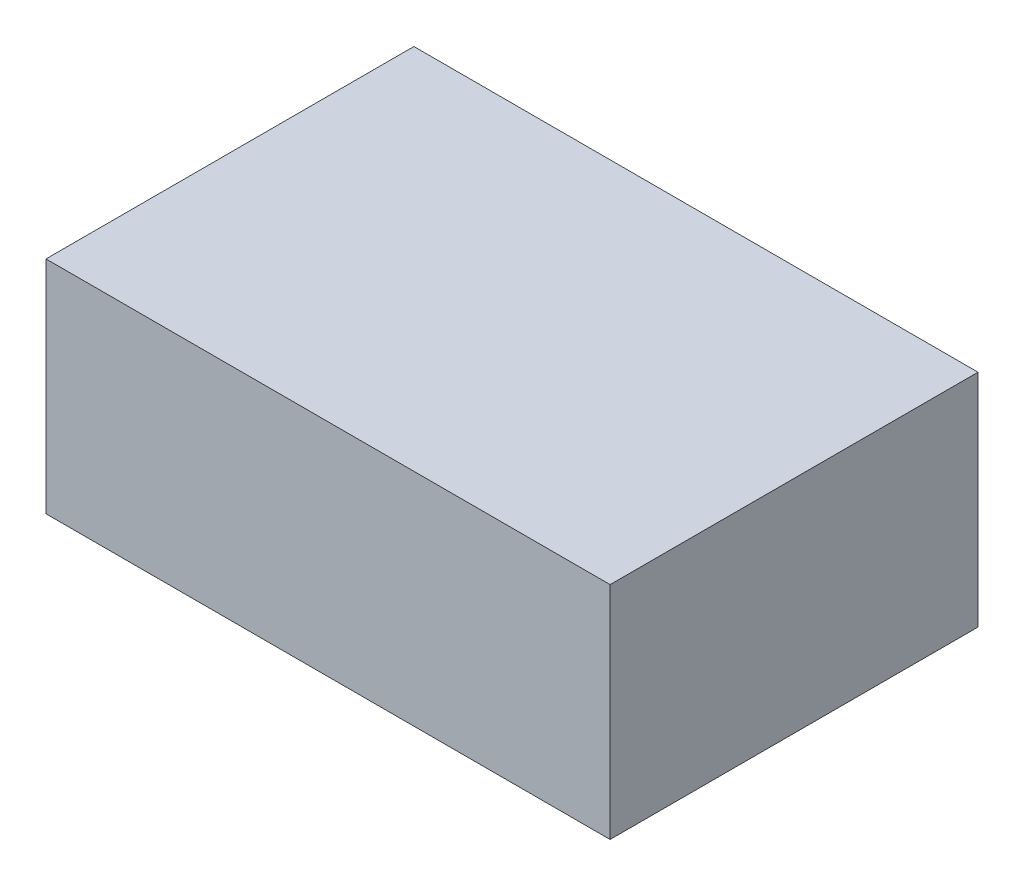
ISO-10303-21;
HEADER;
FILE_DESCRIPTION(('STEP AP214'),'2;1');
FILE_NAME('part.step','',(''),(''),'','','');
FILE_SCHEMA(('AUTOMOTIVE_DESIGN { 1 0 10303 214 1 1 1 1 }'));
ENDSEC;
DATA;
#1=APPLICATION_CONTEXT('core data for automotive mechanical design processes');
#2=APPLICATION_PROTOCOL_DEFINITION('international standard','automotive_design',2000,#1);
#3=PRODUCT_CONTEXT('',#1,'mechanical');
#4=PRODUCT('Part','Part','',(#3));
#5=PRODUCT_RELATED_PRODUCT_CATEGORY('part','',(#4));
#6=PRODUCT_DEFINITION_FORMATION('','',#4);
#7=PRODUCT_DEFINITION_CONTEXT('part definition',#1,'design');
#8=PRODUCT_DEFINITION('design','',#6,#7);
#9=PRODUCT_DEFINITION_SHAPE('','',#8);
#10=(LENGTH_UNIT() NAMED_UNIT(*) SI_UNIT(.MILLI.,.METRE.));
#11=(NAMED_UNIT(*) PLANE_ANGLE_UNIT() SI_UNIT($,.RADIAN.));
#12=(NAMED_UNIT(*) SI_UNIT($,.STERADIAN.) SOLID_ANGLE_UNIT());
#13=UNCERTAINTY_MEASURE_WITH_UNIT(LENGTH_MEASURE(1.E-05),#10,'distance_accuracy_value','');
#14=(GEOMETRIC_REPRESENTATION_CONTEXT(3) GLOBAL_UNCERTAINTY_ASSIGNED_CONTEXT((#13)) GLOBAL_UNIT_ASSIGNED_CONTEXT((#10,
#11,#12)) REPRESENTATION_CONTEXT('',''));
#15=CARTESIAN_POINT('',(0.,0.,0.));
#16=DIRECTION('',(0.,0.,1.));
#17=DIRECTION('',(1.,0.,0.));
#18=AXIS2_PLACEMENT_3D('',#15,#16,#17);
#19=CARTESIAN_POINT('',(-51.5070422535211,45.,-27.0492957746479));
#20=DIRECTION('',(1.,0.,0.));
#21=DIRECTION('',(0.,0.,-1.));
#22=AXIS2_PLACEMENT_3D('',#19,#20,#21);
#23=PLANE('',#22);
#24=DIRECTION('',(0.,0.,1.));
#25=VECTOR('',#24,1.);
#26=CARTESIAN_POINT('',(-51.5070422535211,0.,-27.0492957746479));
#27=LINE('',#26,#25);
#28=CARTESIAN_POINT('',(-51.5070422535211,0.,-27.0492957746479));
#29=VERTEX_POINT('',#28);
#30=CARTESIAN_POINT('',(-51.5070422535211,0.,47.9507042253521));
#31=VERTEX_POINT('',#30);
#32=EDGE_CURVE('E96',#29,#31,#27,.T.);
#33=ORIENTED_EDGE('',*,*,#32,.T.);
#34=DIRECTION('',(0.,-1.,0.));
#35=VECTOR('',#34,1.);
#36=CARTESIAN_POINT('',(-51.5070422535211,45.,47.9507042253521));
#37=LINE('',#36,#35);
#38=CARTESIAN_POINT('',(-51.5070422535211,45.,47.9507042253521));
#39=VERTEX_POINT('',#38);
#40=EDGE_CURVE('E11',#39,#31,#37,.T.);
#41=ORIENTED_EDGE('',*,*,#40,.F.);
#42=DIRECTION('',(0.,0.,1.));
#43=VECTOR('',#42,1.);
#44=CARTESIAN_POINT('',(-51.5070422535211,45.,-27.0492957746479));
#45=LINE('',#44,#43);
#46=CARTESIAN_POINT('',(-51.5070422535211,45.,-27.0492957746479));
#47=VERTEX_POINT('',#46);
#48=EDGE_CURVE('E84',#47,#39,#45,.T.);
#49=ORIENTED_EDGE('',*,*,#48,.F.);
#50=DIRECTION('',(0.,-1.,0.));
#51=VECTOR('',#50,1.);
#52=CARTESIAN_POINT('',(-51.5070422535211,45.,-27.0492957746479));
#53=LINE('',#52,#51);
#54=EDGE_CURVE('E92',#47,#29,#53,.T.);
#55=ORIENTED_EDGE('',*,*,#54,.T.);
#56=EDGE_LOOP('',(#33,#41,#49,#55));
#57=FACE_BOUND('',#56,.T.);
#58=ADVANCED_FACE('F33',(#57),#23,.F.);
#59=CARTESIAN_POINT('',(-51.5070422535211,45.,47.9507042253521));
#60=DIRECTION('',(0.,0.,-1.));
#61=DIRECTION('',(-1.,0.,0.));
#62=AXIS2_PLACEMENT_3D('',#59,#60,#61);
#63=PLANE('',#62);
#64=DIRECTION('',(1.,0.,0.));
#65=VECTOR('',#64,1.);
#66=CARTESIAN_POINT('',(-51.5070422535211,0.,47.9507042253521));
#67=LINE('',#66,#65);
#68=CARTESIAN_POINT('',(63.4929577464789,0.,47.9507042253521));
#69=VERTEX_POINT('',#68);
#70=EDGE_CURVE('E88',#31,#69,#67,.T.);
#71=ORIENTED_EDGE('',*,*,#70,.T.);
#72=DIRECTION('',(0.,-1.,0.));
#73=VECTOR('',#72,1.);
#74=CARTESIAN_POINT('',(63.4929577464789,45.,47.9507042253521));
#75=LINE('',#74,#73);
#76=CARTESIAN_POINT('',(63.4929577464789,45.,47.9507042253521));
#77=VERTEX_POINT('',#76);
#78=EDGE_CURVE('E41',#77,#69,#75,.T.);
#79=ORIENTED_EDGE('',*,*,#78,.F.);
#80=DIRECTION('',(1.,0.,0.));
#81=VECTOR('',#80,1.);
#82=CARTESIAN_POINT('',(-51.5070422535211,45.,47.9507042253521));
#83=LINE('',#82,#81);
#84=EDGE_CURVE('E79',#39,#77,#83,.T.);
#85=ORIENTED_EDGE('',*,*,#84,.F.);
#86=ORIENTED_EDGE('',*,*,#40,.T.);
#87=EDGE_LOOP('',(#71,#79,#85,#86));
#88=FACE_BOUND('',#87,.T.);
#89=ADVANCED_FACE('F87',(#88),#63,.F.);
#90=CARTESIAN_POINT('',(63.4929577464789,45.,-27.0492957746479));
#91=DIRECTION('',(-1.,0.,0.));
#92=DIRECTION('',(0.,0.,1.));
#93=AXIS2_PLACEMENT_3D('',#90,#91,#92);
#94=PLANE('',#93);
#95=DIRECTION('',(0.,0.,-1.));
#96=VECTOR('',#95,1.);
#97=CARTESIAN_POINT('',(63.4929577464789,0.,-27.0492957746479));
#98=LINE('',#97,#96);
#99=CARTESIAN_POINT('',(63.4929577464789,0.,-27.0492957746479));
#100=VERTEX_POINT('',#99);
#101=EDGE_CURVE('E66',#69,#100,#98,.T.);
#102=ORIENTED_EDGE('',*,*,#101,.T.);
#103=DIRECTION('',(0.,-1.,0.));
#104=VECTOR('',#103,1.);
#105=CARTESIAN_POINT('',(63.4929577464789,45.,-27.0492957746479));
#106=LINE('',#105,#104);
#107=CARTESIAN_POINT('',(63.4929577464789,45.,-27.0492957746479));
#108=VERTEX_POINT('',#107);
#109=EDGE_CURVE('E89',#108,#100,#106,.T.);
#110=ORIENTED_EDGE('',*,*,#109,.F.);
#111=DIRECTION('',(0.,0.,-1.));
#112=VECTOR('',#111,1.);
#113=CARTESIAN_POINT('',(63.4929577464789,45.,-27.0492957746479));
#114=LINE('',#113,#112);
#115=EDGE_CURVE('E82',#77,#108,#114,.T.);
#116=ORIENTED_EDGE('',*,*,#115,.F.);
#117=ORIENTED_EDGE('',*,*,#78,.T.);
#118=EDGE_LOOP('',(#102,#110,#116,#117));
#119=FACE_BOUND('',#118,.T.);
#120=ADVANCED_FACE('F90',(#119),#94,.F.);
#121=CARTESIAN_POINT('',(-51.5070422535211,45.,-27.0492957746479));
#122=DIRECTION('',(0.,0.,1.));
#123=DIRECTION('',(1.,0.,0.));
#124=AXIS2_PLACEMENT_3D('',#121,#122,#123);
#125=PLANE('',#124);
#126=DIRECTION('',(-1.,0.,0.));
#127=VECTOR('',#126,1.);
#128=CARTESIAN_POINT('',(-51.5070422535211,0.,-27.0492957746479));
#129=LINE('',#128,#127);
#130=EDGE_CURVE('E72',#100,#29,#129,.T.);
#131=ORIENTED_EDGE('',*,*,#130,.T.);
#132=ORIENTED_EDGE('',*,*,#54,.F.);
#133=DIRECTION('',(-1.,0.,0.));
#134=VECTOR('',#133,1.);
#135=CARTESIAN_POINT('',(-51.5070422535211,45.,-27.0492957746479));
#136=LINE('',#135,#134);
#137=EDGE_CURVE('E49',#108,#47,#136,.T.);
#138=ORIENTED_EDGE('',*,*,#137,.F.);
#139=ORIENTED_EDGE('',*,*,#109,.T.);
#140=EDGE_LOOP('',(#131,#132,#138,#139));
#141=FACE_BOUND('',#140,.T.);
#142=ADVANCED_FACE('F103',(#141),#125,.F.);
#143=CARTESIAN_POINT('',(0.,45.,0.));
#144=DIRECTION('',(0.,1.,0.));
#145=DIRECTION('',(0.,0.,1.));
#146=AXIS2_PLACEMENT_3D('',#143,#144,#145);
#147=PLANE('',#146);
#148=ORIENTED_EDGE('',*,*,#48,.T.);
#149=ORIENTED_EDGE('',*,*,#84,.T.);
#150=ORIENTED_EDGE('',*,*,#115,.T.);
#151=ORIENTED_EDGE('',*,*,#137,.T.);
#152=EDGE_LOOP('',(#148,#149,#150,#151));
#153=FACE_BOUND('',#152,.T.);
#154=ADVANCED_FACE('F80',(#153),#147,.T.);
#155=CARTESIAN_POINT('',(0.,0.,0.));
#156=DIRECTION('',(0.,1.,0.));
#157=DIRECTION('',(0.,0.,1.));
#158=AXIS2_PLACEMENT_3D('',#155,#156,#157);
#159=PLANE('',#158);
#160=ORIENTED_EDGE('',*,*,#32,.F.);
#161=ORIENTED_EDGE('',*,*,#130,.F.);
#162=ORIENTED_EDGE('',*,*,#101,.F.);
#163=ORIENTED_EDGE('',*,*,#70,.F.);
#164=EDGE_LOOP('',(#160,#161,#162,#163));
#165=FACE_BOUND('',#164,.T.);
#166=ADVANCED_FACE('F106',(#165),#159,.F.);
#167=CLOSED_SHELL('',(#58,#89,#120,#142,#154,#166));
#168=MANIFOLD_SOLID_BREP('B2',#167);
#169=ADVANCED_BREP_SHAPE_REPRESENTATION('',(#18,#168),#14);
#170=SHAPE_DEFINITION_REPRESENTATION(#9,#169);
ENDSEC;
END-ISO-10303-21;
